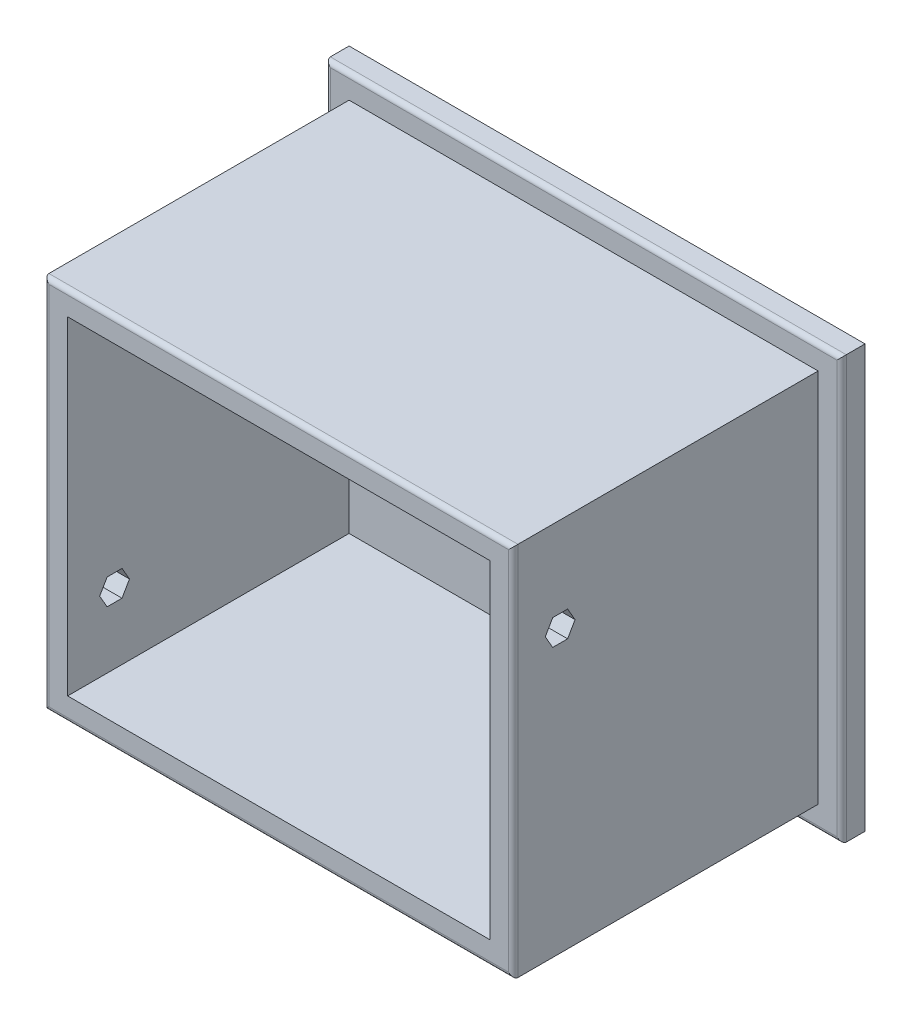
ISO-10303-21;
HEADER;
FILE_DESCRIPTION(('STEP AP214'),'2;1');
FILE_NAME('part.step','',(''),(''),'','','');
FILE_SCHEMA(('AUTOMOTIVE_DESIGN { 1 0 10303 214 1 1 1 1 }'));
ENDSEC;
DATA;
#1=APPLICATION_CONTEXT('core data for automotive mechanical design processes');
#2=APPLICATION_PROTOCOL_DEFINITION('international standard','automotive_design',2000,#1);
#3=PRODUCT_CONTEXT('',#1,'mechanical');
#4=PRODUCT('Part','Part','',(#3));
#5=PRODUCT_RELATED_PRODUCT_CATEGORY('part','',(#4));
#6=PRODUCT_DEFINITION_FORMATION('','',#4);
#7=PRODUCT_DEFINITION_CONTEXT('part definition',#1,'design');
#8=PRODUCT_DEFINITION('design','',#6,#7);
#9=PRODUCT_DEFINITION_SHAPE('','',#8);
#10=(LENGTH_UNIT() NAMED_UNIT(*) SI_UNIT(.MILLI.,.METRE.));
#11=(NAMED_UNIT(*) PLANE_ANGLE_UNIT() SI_UNIT($,.RADIAN.));
#12=(NAMED_UNIT(*) SI_UNIT($,.STERADIAN.) SOLID_ANGLE_UNIT());
#13=UNCERTAINTY_MEASURE_WITH_UNIT(LENGTH_MEASURE(1.E-05),#10,'distance_accuracy_value','');
#14=(GEOMETRIC_REPRESENTATION_CONTEXT(3) GLOBAL_UNCERTAINTY_ASSIGNED_CONTEXT((#13)) GLOBAL_UNIT_ASSIGNED_CONTEXT((#10,
#11,#12)) REPRESENTATION_CONTEXT('',''));
#15=CARTESIAN_POINT('',(0.,0.,0.));
#16=DIRECTION('',(0.,0.,1.));
#17=DIRECTION('',(1.,0.,0.));
#18=AXIS2_PLACEMENT_3D('',#15,#16,#17);
#19=CARTESIAN_POINT('',(0.,-72.1550184722737,5.));
#20=DIRECTION('',(0.,1.,0.));
#21=DIRECTION('',(-1.,0.,0.));
#22=AXIS2_PLACEMENT_3D('',#19,#20,#21);
#23=PLANE('',#22);
#24=DIRECTION('',(0.,0.,-1.));
#25=VECTOR('',#24,1.);
#26=CARTESIAN_POINT('',(1.62296722866587,-72.1550184722737,5.));
#27=LINE('',#26,#25);
#28=CARTESIAN_POINT('',(1.62296722866587,-72.1550184722737,4.));
#29=VERTEX_POINT('',#28);
#30=CARTESIAN_POINT('',(1.62296722866587,-72.1550184722737,0.));
#31=VERTEX_POINT('',#30);
#32=EDGE_CURVE('E384',#29,#31,#27,.T.);
#33=ORIENTED_EDGE('',*,*,#32,.F.);
#34=DIRECTION('',(1.,0.,0.));
#35=VECTOR('',#34,1.);
#36=CARTESIAN_POINT('',(-108.377032771334,-72.1550184722737,4.));
#37=LINE('',#36,#35);
#38=CARTESIAN_POINT('',(-108.377032771334,-72.1550184722737,4.));
#39=VERTEX_POINT('',#38);
#40=EDGE_CURVE('E11',#29,#39,#37,.F.);
#41=ORIENTED_EDGE('',*,*,#40,.T.);
#42=DIRECTION('',(0.,0.,-1.));
#43=VECTOR('',#42,1.);
#44=CARTESIAN_POINT('',(-108.377032771334,-72.1550184722737,5.));
#45=LINE('',#44,#43);
#46=CARTESIAN_POINT('',(-108.377032771334,-72.1550184722737,0.));
#47=VERTEX_POINT('',#46);
#48=EDGE_CURVE('E368',#39,#47,#45,.T.);
#49=ORIENTED_EDGE('',*,*,#48,.T.);
#50=DIRECTION('',(1.,0.,0.));
#51=VECTOR('',#50,1.);
#52=CARTESIAN_POINT('',(0.,-72.1550184722737,0.));
#53=LINE('',#52,#51);
#54=EDGE_CURVE('E348',#47,#31,#53,.T.);
#55=ORIENTED_EDGE('',*,*,#54,.T.);
#56=EDGE_LOOP('',(#33,#41,#49,#55));
#57=FACE_BOUND('',#56,.T.);
#58=ADVANCED_FACE('F35',(#57),#23,.F.);
#59=CARTESIAN_POINT('',(1.62296722866584,0.,5.));
#60=DIRECTION('',(-1.,0.,0.));
#61=DIRECTION('',(0.,-1.,0.));
#62=AXIS2_PLACEMENT_3D('',#59,#60,#61);
#63=PLANE('',#62);
#64=DIRECTION('',(0.,0.,-1.));
#65=VECTOR('',#64,1.);
#66=CARTESIAN_POINT('',(1.62296722866584,17.8449815277263,5.));
#67=LINE('',#66,#65);
#68=CARTESIAN_POINT('',(1.62296722866584,17.8449815277263,4.));
#69=VERTEX_POINT('',#68);
#70=CARTESIAN_POINT('',(1.62296722866584,17.8449815277263,0.));
#71=VERTEX_POINT('',#70);
#72=EDGE_CURVE('E382',#69,#71,#67,.T.);
#73=ORIENTED_EDGE('',*,*,#72,.F.);
#74=DIRECTION('',(0.,1.,0.));
#75=VECTOR('',#74,1.);
#76=CARTESIAN_POINT('',(1.62296722866587,-72.1550184722737,4.));
#77=LINE('',#76,#75);
#78=EDGE_CURVE('E434',#69,#29,#77,.F.);
#79=ORIENTED_EDGE('',*,*,#78,.T.);
#80=ORIENTED_EDGE('',*,*,#32,.T.);
#81=DIRECTION('',(0.,1.,0.));
#82=VECTOR('',#81,1.);
#83=CARTESIAN_POINT('',(1.62296722866584,0.,0.));
#84=LINE('',#83,#82);
#85=EDGE_CURVE('E371',#31,#71,#84,.T.);
#86=ORIENTED_EDGE('',*,*,#85,.T.);
#87=EDGE_LOOP('',(#73,#79,#80,#86));
#88=FACE_BOUND('',#87,.T.);
#89=ADVANCED_FACE('F465',(#88),#63,.F.);
#90=CARTESIAN_POINT('',(0.,17.8449815277263,5.));
#91=DIRECTION('',(0.,1.,0.));
#92=DIRECTION('',(-1.,0.,0.));
#93=AXIS2_PLACEMENT_3D('',#90,#91,#92);
#94=PLANE('',#93);
#95=DIRECTION('',(0.,0.,-1.));
#96=VECTOR('',#95,1.);
#97=CARTESIAN_POINT('',(-108.377032771334,17.8449815277263,5.));
#98=LINE('',#97,#96);
#99=CARTESIAN_POINT('',(-108.377032771334,17.8449815277263,4.));
#100=VERTEX_POINT('',#99);
#101=CARTESIAN_POINT('',(-108.377032771334,17.8449815277263,0.));
#102=VERTEX_POINT('',#101);
#103=EDGE_CURVE('E380',#100,#102,#98,.T.);
#104=ORIENTED_EDGE('',*,*,#103,.F.);
#105=DIRECTION('',(1.,0.,0.));
#106=VECTOR('',#105,1.);
#107=CARTESIAN_POINT('',(0.,17.8449815277263,4.));
#108=LINE('',#107,#106);
#109=EDGE_CURVE('E437',#100,#69,#108,.T.);
#110=ORIENTED_EDGE('',*,*,#109,.T.);
#111=ORIENTED_EDGE('',*,*,#72,.T.);
#112=DIRECTION('',(1.,0.,0.));
#113=VECTOR('',#112,1.);
#114=CARTESIAN_POINT('',(0.,17.8449815277263,0.));
#115=LINE('',#114,#113);
#116=EDGE_CURVE('E374',#102,#71,#115,.T.);
#117=ORIENTED_EDGE('',*,*,#116,.F.);
#118=EDGE_LOOP('',(#104,#110,#111,#117));
#119=FACE_BOUND('',#118,.T.);
#120=ADVANCED_FACE('F461',(#119),#94,.T.);
#121=CARTESIAN_POINT('',(-108.377032771334,0.,5.));
#122=DIRECTION('',(-1.,0.,0.));
#123=DIRECTION('',(0.,0.,1.));
#124=AXIS2_PLACEMENT_3D('',#121,#122,#123);
#125=PLANE('',#124);
#126=ORIENTED_EDGE('',*,*,#48,.F.);
#127=DIRECTION('',(0.,1.,0.));
#128=VECTOR('',#127,1.);
#129=CARTESIAN_POINT('',(-108.377032771334,0.,4.));
#130=LINE('',#129,#128);
#131=EDGE_CURVE('E44',#39,#100,#130,.T.);
#132=ORIENTED_EDGE('',*,*,#131,.T.);
#133=ORIENTED_EDGE('',*,*,#103,.T.);
#134=DIRECTION('',(0.,1.,0.));
#135=VECTOR('',#134,1.);
#136=CARTESIAN_POINT('',(-108.377032771334,0.,0.));
#137=LINE('',#136,#135);
#138=EDGE_CURVE('E359',#47,#102,#137,.T.);
#139=ORIENTED_EDGE('',*,*,#138,.F.);
#140=EDGE_LOOP('',(#126,#132,#133,#139));
#141=FACE_BOUND('',#140,.T.);
#142=ADVANCED_FACE('F475',(#141),#125,.T.);
#143=CARTESIAN_POINT('',(0.,0.,5.));
#144=DIRECTION('',(0.,0.,1.));
#145=DIRECTION('',(1.,0.,0.));
#146=AXIS2_PLACEMENT_3D('',#143,#144,#145);
#147=PLANE('',#146);
#148=DIRECTION('',(1.,0.,0.));
#149=VECTOR('',#148,1.);
#150=CARTESIAN_POINT('',(1.62296722866587,-71.1550184722737,5.));
#151=LINE('',#150,#149);
#152=CARTESIAN_POINT('',(-107.377032771334,-71.1550184722737,5.));
#153=VERTEX_POINT('',#152);
#154=CARTESIAN_POINT('',(0.622967228665867,-71.1550184722737,5.));
#155=VERTEX_POINT('',#154);
#156=EDGE_CURVE('E415',#153,#155,#151,.T.);
#157=ORIENTED_EDGE('',*,*,#156,.T.);
#158=DIRECTION('',(0.,1.,0.));
#159=VECTOR('',#158,1.);
#160=CARTESIAN_POINT('',(0.622967228665839,17.8449815277263,5.));
#161=LINE('',#160,#159);
#162=CARTESIAN_POINT('',(0.622967228665839,16.8449815277263,5.));
#163=VERTEX_POINT('',#162);
#164=EDGE_CURVE('E431',#155,#163,#161,.T.);
#165=ORIENTED_EDGE('',*,*,#164,.T.);
#166=DIRECTION('',(1.,0.,0.));
#167=VECTOR('',#166,1.);
#168=CARTESIAN_POINT('',(0.,16.8449815277263,5.));
#169=LINE('',#168,#167);
#170=CARTESIAN_POINT('',(-107.377032771334,16.8449815277263,5.));
#171=VERTEX_POINT('',#170);
#172=EDGE_CURVE('E429',#163,#171,#169,.F.);
#173=ORIENTED_EDGE('',*,*,#172,.T.);
#174=DIRECTION('',(0.,1.,0.));
#175=VECTOR('',#174,1.);
#176=CARTESIAN_POINT('',(-107.377032771334,0.,5.));
#177=LINE('',#176,#175);
#178=EDGE_CURVE('E427',#171,#153,#177,.F.);
#179=ORIENTED_EDGE('',*,*,#178,.T.);
#180=EDGE_LOOP('',(#157,#165,#173,#179));
#181=FACE_BOUND('',#180,.T.);
#182=DIRECTION('',(0.,1.,0.));
#183=VECTOR('',#182,1.);
#184=CARTESIAN_POINT('',(-3.37703277133414,0.,5.));
#185=LINE('',#184,#183);
#186=CARTESIAN_POINT('',(-3.37703277133414,-67.1550184722737,5.));
#187=VERTEX_POINT('',#186);
#188=CARTESIAN_POINT('',(-3.37703277133414,12.8449815277263,5.));
#189=VERTEX_POINT('',#188);
#190=EDGE_CURVE('E355',#187,#189,#185,.T.);
#191=ORIENTED_EDGE('',*,*,#190,.F.);
#192=DIRECTION('',(1.,0.,0.));
#193=VECTOR('',#192,1.);
#194=CARTESIAN_POINT('',(0.,-67.1550184722737,5.));
#195=LINE('',#194,#193);
#196=CARTESIAN_POINT('',(-103.377032771334,-67.1550184722737,5.));
#197=VERTEX_POINT('',#196);
#198=EDGE_CURVE('E358',#197,#187,#195,.T.);
#199=ORIENTED_EDGE('',*,*,#198,.F.);
#200=DIRECTION('',(0.,1.,0.));
#201=VECTOR('',#200,1.);
#202=CARTESIAN_POINT('',(-103.377032771334,0.,5.));
#203=LINE('',#202,#201);
#204=CARTESIAN_POINT('',(-103.377032771334,12.8449815277263,5.));
#205=VERTEX_POINT('',#204);
#206=EDGE_CURVE('E362',#197,#205,#203,.T.);
#207=ORIENTED_EDGE('',*,*,#206,.T.);
#208=DIRECTION('',(1.,0.,0.));
#209=VECTOR('',#208,1.);
#210=CARTESIAN_POINT('',(0.,12.8449815277263,5.));
#211=LINE('',#210,#209);
#212=EDGE_CURVE('E365',#205,#189,#211,.T.);
#213=ORIENTED_EDGE('',*,*,#212,.T.);
#214=EDGE_LOOP('',(#191,#199,#207,#213));
#215=FACE_BOUND('',#214,.T.);
#216=ADVANCED_FACE('F471',(#181,#215),#147,.T.);
#217=CARTESIAN_POINT('',(0.,0.,0.));
#218=DIRECTION('',(0.,0.,1.));
#219=DIRECTION('',(1.,0.,0.));
#220=AXIS2_PLACEMENT_3D('',#217,#218,#219);
#221=PLANE('',#220);
#222=ORIENTED_EDGE('',*,*,#54,.F.);
#223=ORIENTED_EDGE('',*,*,#138,.T.);
#224=ORIENTED_EDGE('',*,*,#116,.T.);
#225=ORIENTED_EDGE('',*,*,#85,.F.);
#226=EDGE_LOOP('',(#222,#223,#224,#225));
#227=FACE_BOUND('',#226,.T.);
#228=ADVANCED_FACE('F474',(#227),#221,.F.);
#229=CARTESIAN_POINT('',(0.,7.84498152772627,70.));
#230=DIRECTION('',(0.,1.,0.));
#231=DIRECTION('',(0.,0.,1.));
#232=AXIS2_PLACEMENT_3D('',#229,#230,#231);
#233=PLANE('',#232);
#234=DIRECTION('',(0.,0.,-1.));
#235=VECTOR('',#234,1.);
#236=CARTESIAN_POINT('',(-98.3770327713341,7.84498152772627,70.));
#237=LINE('',#236,#235);
#238=CARTESIAN_POINT('',(-98.3770327713341,7.84498152772627,70.));
#239=VERTEX_POINT('',#238);
#240=CARTESIAN_POINT('',(-98.3770327713341,7.84498152772627,10.));
#241=VERTEX_POINT('',#240);
#242=EDGE_CURVE('E336',#239,#241,#237,.T.);
#243=ORIENTED_EDGE('',*,*,#242,.T.);
#244=DIRECTION('',(1.,0.,0.));
#245=VECTOR('',#244,1.);
#246=CARTESIAN_POINT('',(0.,7.84498152772627,10.));
#247=LINE('',#246,#245);
#248=CARTESIAN_POINT('',(-8.37703277133414,7.84498152772627,10.));
#249=VERTEX_POINT('',#248);
#250=EDGE_CURVE('E316',#241,#249,#247,.T.);
#251=ORIENTED_EDGE('',*,*,#250,.T.);
#252=DIRECTION('',(0.,0.,-1.));
#253=VECTOR('',#252,1.);
#254=CARTESIAN_POINT('',(-8.37703277133414,7.84498152772627,70.));
#255=LINE('',#254,#253);
#256=CARTESIAN_POINT('',(-8.37703277133414,7.84498152772627,70.));
#257=VERTEX_POINT('',#256);
#258=EDGE_CURVE('E345',#257,#249,#255,.T.);
#259=ORIENTED_EDGE('',*,*,#258,.F.);
#260=DIRECTION('',(1.,0.,0.));
#261=VECTOR('',#260,1.);
#262=CARTESIAN_POINT('',(0.,7.84498152772627,70.));
#263=LINE('',#262,#261);
#264=EDGE_CURVE('E324',#239,#257,#263,.T.);
#265=ORIENTED_EDGE('',*,*,#264,.F.);
#266=EDGE_LOOP('',(#243,#251,#259,#265));
#267=FACE_BOUND('',#266,.T.);
#268=ADVANCED_FACE('F533',(#267),#233,.F.);
#269=CARTESIAN_POINT('',(-8.37703277133414,0.,70.));
#270=DIRECTION('',(1.,0.,0.));
#271=DIRECTION('',(0.,1.,0.));
#272=AXIS2_PLACEMENT_3D('',#269,#270,#271);
#273=PLANE('',#272);
#274=DIRECTION('',(0.,0.,-1.));
#275=VECTOR('',#274,1.);
#276=CARTESIAN_POINT('',(-8.37703277133414,-9.90501847227374,70.));
#277=LINE('',#276,#275);
#278=CARTESIAN_POINT('',(-8.37703277133414,-9.90501847227374,61.5877132402715));
#279=VERTEX_POINT('',#278);
#280=CARTESIAN_POINT('',(-8.37703277133414,-9.90501847227374,58.4122867597285));
#281=VERTEX_POINT('',#280);
#282=EDGE_CURVE('E308',#279,#281,#277,.T.);
#283=ORIENTED_EDGE('',*,*,#282,.T.);
#284=DIRECTION('',(0.,0.866025403784439,-0.5));
#285=VECTOR('',#284,1.);
#286=CARTESIAN_POINT('',(-8.37703277133414,-7.49388163699063,57.0202162588248));
#287=LINE('',#286,#285);
#288=CARTESIAN_POINT('',(-8.37703277133414,-7.15501847227373,56.8245735194571));
#289=VERTEX_POINT('',#288);
#290=EDGE_CURVE('E311',#281,#289,#287,.T.);
#291=ORIENTED_EDGE('',*,*,#290,.T.);
#292=DIRECTION('',(0.,0.866025403784438,0.500000000000001));
#293=VECTOR('',#292,1.);
#294=CARTESIAN_POINT('',(-8.37703277133414,3.91637240085376,63.2166440203608));
#295=LINE('',#294,#293);
#296=CARTESIAN_POINT('',(-8.37703277133414,-4.40501847227374,58.4122867597285));
#297=VERTEX_POINT('',#296);
#298=EDGE_CURVE('E286',#289,#297,#295,.T.);
#299=ORIENTED_EDGE('',*,*,#298,.T.);
#300=DIRECTION('',(0.,0.,1.));
#301=VECTOR('',#300,1.);
#302=CARTESIAN_POINT('',(-8.37703277133414,-4.40501847227374,70.));
#303=LINE('',#302,#301);
#304=CARTESIAN_POINT('',(-8.37703277133414,-4.40501847227374,61.5877132402715));
#305=VERTEX_POINT('',#304);
#306=EDGE_CURVE('E299',#297,#305,#303,.T.);
#307=ORIENTED_EDGE('',*,*,#306,.T.);
#308=DIRECTION('',(0.,-0.866025403784439,0.5));
#309=VECTOR('',#308,1.);
#310=CARTESIAN_POINT('',(-8.37703277133414,-4.74388163699063,61.7833559796392));
#311=LINE('',#310,#309);
#312=CARTESIAN_POINT('',(-8.37703277133414,-7.15501847227374,63.1754264805429));
#313=VERTEX_POINT('',#312);
#314=EDGE_CURVE('E302',#305,#313,#311,.T.);
#315=ORIENTED_EDGE('',*,*,#314,.T.);
#316=DIRECTION('',(0.,-0.866025403784438,-0.500000000000001));
#317=VECTOR('',#316,1.);
#318=CARTESIAN_POINT('',(-8.37703277133414,1.16637240085375,67.9797837411752));
#319=LINE('',#318,#317);
#320=EDGE_CURVE('E305',#313,#279,#319,.T.);
#321=ORIENTED_EDGE('',*,*,#320,.T.);
#322=EDGE_LOOP('',(#283,#291,#299,#307,#315,#321));
#323=FACE_BOUND('',#322,.T.);
#324=ORIENTED_EDGE('',*,*,#258,.T.);
#325=DIRECTION('',(0.,-1.,0.));
#326=VECTOR('',#325,1.);
#327=CARTESIAN_POINT('',(-8.37703277133414,0.,10.));
#328=LINE('',#327,#326);
#329=CARTESIAN_POINT('',(-8.37703277133413,-62.1550184722737,10.));
#330=VERTEX_POINT('',#329);
#331=EDGE_CURVE('E314',#249,#330,#328,.T.);
#332=ORIENTED_EDGE('',*,*,#331,.T.);
#333=DIRECTION('',(0.,0.,-1.));
#334=VECTOR('',#333,1.);
#335=CARTESIAN_POINT('',(-8.37703277133413,-62.1550184722737,70.));
#336=LINE('',#335,#334);
#337=CARTESIAN_POINT('',(-8.37703277133413,-62.1550184722737,70.));
#338=VERTEX_POINT('',#337);
#339=EDGE_CURVE('E342',#338,#330,#336,.T.);
#340=ORIENTED_EDGE('',*,*,#339,.F.);
#341=DIRECTION('',(0.,-1.,0.));
#342=VECTOR('',#341,1.);
#343=CARTESIAN_POINT('',(-8.37703277133414,0.,70.));
#344=LINE('',#343,#342);
#345=EDGE_CURVE('E327',#257,#338,#344,.T.);
#346=ORIENTED_EDGE('',*,*,#345,.F.);
#347=EDGE_LOOP('',(#324,#332,#340,#346));
#348=FACE_BOUND('',#347,.T.);
#349=ADVANCED_FACE('F549',(#323,#348),#273,.F.);
#350=CARTESIAN_POINT('',(0.,-62.1550184722737,70.));
#351=DIRECTION('',(0.,1.,0.));
#352=DIRECTION('',(0.,0.,1.));
#353=AXIS2_PLACEMENT_3D('',#350,#351,#352);
#354=PLANE('',#353);
#355=DIRECTION('',(1.,0.,0.));
#356=VECTOR('',#355,1.);
#357=CARTESIAN_POINT('',(0.,-62.1550184722737,10.));
#358=LINE('',#357,#356);
#359=CARTESIAN_POINT('',(-98.3770327713341,-62.1550184722737,10.));
#360=VERTEX_POINT('',#359);
#361=EDGE_CURVE('E321',#360,#330,#358,.T.);
#362=ORIENTED_EDGE('',*,*,#361,.F.);
#363=DIRECTION('',(0.,0.,-1.));
#364=VECTOR('',#363,1.);
#365=CARTESIAN_POINT('',(-98.3770327713341,-62.1550184722737,70.));
#366=LINE('',#365,#364);
#367=CARTESIAN_POINT('',(-98.3770327713341,-62.1550184722737,70.));
#368=VERTEX_POINT('',#367);
#369=EDGE_CURVE('E339',#368,#360,#366,.T.);
#370=ORIENTED_EDGE('',*,*,#369,.F.);
#371=DIRECTION('',(1.,0.,0.));
#372=VECTOR('',#371,1.);
#373=CARTESIAN_POINT('',(0.,-62.1550184722737,70.));
#374=LINE('',#373,#372);
#375=EDGE_CURVE('E329',#368,#338,#374,.T.);
#376=ORIENTED_EDGE('',*,*,#375,.T.);
#377=ORIENTED_EDGE('',*,*,#339,.T.);
#378=EDGE_LOOP('',(#362,#370,#376,#377));
#379=FACE_BOUND('',#378,.T.);
#380=ADVANCED_FACE('F538',(#379),#354,.T.);
#381=CARTESIAN_POINT('',(0.,-67.1550184722737,70.));
#382=DIRECTION('',(0.,1.,0.));
#383=DIRECTION('',(0.,0.,1.));
#384=AXIS2_PLACEMENT_3D('',#381,#382,#383);
#385=PLANE('',#384);
#386=DIRECTION('',(0.,0.,-1.));
#387=VECTOR('',#386,1.);
#388=CARTESIAN_POINT('',(-3.37703277133414,-67.1550184722737,70.));
#389=LINE('',#388,#387);
#390=CARTESIAN_POINT('',(-3.37703277133414,-67.1550184722737,69.));
#391=VERTEX_POINT('',#390);
#392=EDGE_CURVE('E340',#391,#187,#389,.T.);
#393=ORIENTED_EDGE('',*,*,#392,.F.);
#394=DIRECTION('',(1.,0.,0.));
#395=VECTOR('',#394,1.);
#396=CARTESIAN_POINT('',(-103.377032771334,-67.1550184722737,69.));
#397=LINE('',#396,#395);
#398=CARTESIAN_POINT('',(-103.377032771334,-67.1550184722737,69.));
#399=VERTEX_POINT('',#398);
#400=EDGE_CURVE('E406',#391,#399,#397,.F.);
#401=ORIENTED_EDGE('',*,*,#400,.T.);
#402=DIRECTION('',(0.,0.,-1.));
#403=VECTOR('',#402,1.);
#404=CARTESIAN_POINT('',(-103.377032771334,-67.1550184722737,70.));
#405=LINE('',#404,#403);
#406=EDGE_CURVE('E335',#399,#197,#405,.T.);
#407=ORIENTED_EDGE('',*,*,#406,.T.);
#408=ORIENTED_EDGE('',*,*,#198,.T.);
#409=EDGE_LOOP('',(#393,#401,#407,#408));
#410=FACE_BOUND('',#409,.T.);
#411=ADVANCED_FACE('F488',(#410),#385,.F.);
#412=CARTESIAN_POINT('',(-3.37703277133414,0.,70.));
#413=DIRECTION('',(-1.,0.,0.));
#414=DIRECTION('',(0.,0.,1.));
#415=AXIS2_PLACEMENT_3D('',#412,#413,#414);
#416=PLANE('',#415);
#417=DIRECTION('',(0.,0.866025403784438,0.500000000000001));
#418=VECTOR('',#417,1.);
#419=CARTESIAN_POINT('',(-3.37703277133414,-7.15501847227373,56.8245735194571));
#420=LINE('',#419,#418);
#421=CARTESIAN_POINT('',(-3.37703277133414,-7.15501847227373,56.8245735194571));
#422=VERTEX_POINT('',#421);
#423=CARTESIAN_POINT('',(-3.37703277133414,-4.40501847227374,58.4122867597285));
#424=VERTEX_POINT('',#423);
#425=EDGE_CURVE('E268',#422,#424,#420,.T.);
#426=ORIENTED_EDGE('',*,*,#425,.F.);
#427=DIRECTION('',(0.,0.866025403784439,-0.5));
#428=VECTOR('',#427,1.);
#429=CARTESIAN_POINT('',(-3.37703277133414,-9.90501847227374,58.4122867597285));
#430=LINE('',#429,#428);
#431=CARTESIAN_POINT('',(-3.37703277133414,-9.90501847227374,58.4122867597285));
#432=VERTEX_POINT('',#431);
#433=EDGE_CURVE('E260',#432,#422,#430,.T.);
#434=ORIENTED_EDGE('',*,*,#433,.F.);
#435=DIRECTION('',(0.,0.,-1.));
#436=VECTOR('',#435,1.);
#437=CARTESIAN_POINT('',(-3.37703277133414,-9.90501847227374,61.5877132402715));
#438=LINE('',#437,#436);
#439=CARTESIAN_POINT('',(-3.37703277133414,-9.90501847227374,61.5877132402715));
#440=VERTEX_POINT('',#439);
#441=EDGE_CURVE('E280',#440,#432,#438,.T.);
#442=ORIENTED_EDGE('',*,*,#441,.F.);
#443=DIRECTION('',(0.,-0.866025403784438,-0.500000000000001));
#444=VECTOR('',#443,1.);
#445=CARTESIAN_POINT('',(-3.37703277133414,-7.15501847227374,63.1754264805429));
#446=LINE('',#445,#444);
#447=CARTESIAN_POINT('',(-3.37703277133414,-7.15501847227374,63.1754264805429));
#448=VERTEX_POINT('',#447);
#449=EDGE_CURVE('E277',#448,#440,#446,.T.);
#450=ORIENTED_EDGE('',*,*,#449,.F.);
#451=DIRECTION('',(0.,-0.866025403784438,0.5));
#452=VECTOR('',#451,1.);
#453=CARTESIAN_POINT('',(-3.37703277133414,-4.40501847227374,61.5877132402715));
#454=LINE('',#453,#452);
#455=CARTESIAN_POINT('',(-3.37703277133414,-4.40501847227374,61.5877132402715));
#456=VERTEX_POINT('',#455);
#457=EDGE_CURVE('E274',#456,#448,#454,.T.);
#458=ORIENTED_EDGE('',*,*,#457,.F.);
#459=DIRECTION('',(0.,0.,1.));
#460=VECTOR('',#459,1.);
#461=CARTESIAN_POINT('',(-3.37703277133414,-4.40501847227374,58.4122867597285));
#462=LINE('',#461,#460);
#463=EDGE_CURVE('E271',#424,#456,#462,.T.);
#464=ORIENTED_EDGE('',*,*,#463,.F.);
#465=EDGE_LOOP('',(#426,#434,#442,#450,#458,#464));
#466=FACE_BOUND('',#465,.T.);
#467=DIRECTION('',(0.,0.,-1.));
#468=VECTOR('',#467,1.);
#469=CARTESIAN_POINT('',(-3.37703277133414,12.8449815277263,70.));
#470=LINE('',#469,#468);
#471=CARTESIAN_POINT('',(-3.37703277133414,12.8449815277263,69.));
#472=VERTEX_POINT('',#471);
#473=EDGE_CURVE('E352',#472,#189,#470,.T.);
#474=ORIENTED_EDGE('',*,*,#473,.F.);
#475=DIRECTION('',(0.,1.,0.));
#476=VECTOR('',#475,1.);
#477=CARTESIAN_POINT('',(-3.37703277133414,-67.1550184722737,69.));
#478=LINE('',#477,#476);
#479=EDGE_CURVE('E409',#472,#391,#478,.F.);
#480=ORIENTED_EDGE('',*,*,#479,.T.);
#481=ORIENTED_EDGE('',*,*,#392,.T.);
#482=ORIENTED_EDGE('',*,*,#190,.T.);
#483=EDGE_LOOP('',(#474,#480,#481,#482));
#484=FACE_BOUND('',#483,.T.);
#485=ADVANCED_FACE('F482',(#466,#484),#416,.F.);
#486=CARTESIAN_POINT('',(0.,12.8449815277263,70.));
#487=DIRECTION('',(0.,1.,0.));
#488=DIRECTION('',(0.,0.,1.));
#489=AXIS2_PLACEMENT_3D('',#486,#487,#488);
#490=PLANE('',#489);
#491=DIRECTION('',(0.,0.,-1.));
#492=VECTOR('',#491,1.);
#493=CARTESIAN_POINT('',(-103.377032771334,12.8449815277263,70.));
#494=LINE('',#493,#492);
#495=CARTESIAN_POINT('',(-103.377032771334,12.8449815277263,69.));
#496=VERTEX_POINT('',#495);
#497=EDGE_CURVE('E350',#496,#205,#494,.T.);
#498=ORIENTED_EDGE('',*,*,#497,.F.);
#499=DIRECTION('',(1.,0.,0.));
#500=VECTOR('',#499,1.);
#501=CARTESIAN_POINT('',(0.,12.8449815277263,69.));
#502=LINE('',#501,#500);
#503=EDGE_CURVE('E411',#496,#472,#502,.T.);
#504=ORIENTED_EDGE('',*,*,#503,.T.);
#505=ORIENTED_EDGE('',*,*,#473,.T.);
#506=ORIENTED_EDGE('',*,*,#212,.F.);
#507=EDGE_LOOP('',(#498,#504,#505,#506));
#508=FACE_BOUND('',#507,.T.);
#509=ADVANCED_FACE('F495',(#508),#490,.T.);
#510=CARTESIAN_POINT('',(-103.377032771334,0.,70.));
#511=DIRECTION('',(-1.,0.,0.));
#512=DIRECTION('',(0.,0.,1.));
#513=AXIS2_PLACEMENT_3D('',#510,#511,#512);
#514=PLANE('',#513);
#515=DIRECTION('',(0.,0.866025403784439,0.499999999999999));
#516=VECTOR('',#515,1.);
#517=CARTESIAN_POINT('',(-103.377032771334,-49.9050184722737,61.5877132402715));
#518=LINE('',#517,#516);
#519=CARTESIAN_POINT('',(-103.377032771334,-49.9050184722737,61.5877132402715));
#520=VERTEX_POINT('',#519);
#521=CARTESIAN_POINT('',(-103.377032771334,-47.1550184722737,63.175426480543));
#522=VERTEX_POINT('',#521);
#523=EDGE_CURVE('E241',#520,#522,#518,.T.);
#524=ORIENTED_EDGE('',*,*,#523,.F.);
#525=DIRECTION('',(0.,0.,1.));
#526=VECTOR('',#525,1.);
#527=CARTESIAN_POINT('',(-103.377032771334,-49.9050184722737,58.4122867597285));
#528=LINE('',#527,#526);
#529=CARTESIAN_POINT('',(-103.377032771334,-49.9050184722737,58.4122867597285));
#530=VERTEX_POINT('',#529);
#531=EDGE_CURVE('E255',#530,#520,#528,.T.);
#532=ORIENTED_EDGE('',*,*,#531,.F.);
#533=DIRECTION('',(0.,-0.866025403784438,0.5));
#534=VECTOR('',#533,1.);
#535=CARTESIAN_POINT('',(-103.377032771334,-47.1550184722737,56.8245735194571));
#536=LINE('',#535,#534);
#537=CARTESIAN_POINT('',(-103.377032771334,-47.1550184722737,56.8245735194571));
#538=VERTEX_POINT('',#537);
#539=EDGE_CURVE('E249',#538,#530,#536,.T.);
#540=ORIENTED_EDGE('',*,*,#539,.F.);
#541=DIRECTION('',(0.,-0.866025403784439,-0.499999999999999));
#542=VECTOR('',#541,1.);
#543=CARTESIAN_POINT('',(-103.377032771334,-44.4050184722737,58.4122867597285));
#544=LINE('',#543,#542);
#545=CARTESIAN_POINT('',(-103.377032771334,-44.4050184722737,58.4122867597285));
#546=VERTEX_POINT('',#545);
#547=EDGE_CURVE('E247',#546,#538,#544,.T.);
#548=ORIENTED_EDGE('',*,*,#547,.F.);
#549=DIRECTION('',(0.,0.,-1.));
#550=VECTOR('',#549,1.);
#551=CARTESIAN_POINT('',(-103.377032771334,-44.4050184722737,61.5877132402715));
#552=LINE('',#551,#550);
#553=CARTESIAN_POINT('',(-103.377032771334,-44.4050184722737,61.5877132402715));
#554=VERTEX_POINT('',#553);
#555=EDGE_CURVE('E225',#554,#546,#552,.T.);
#556=ORIENTED_EDGE('',*,*,#555,.F.);
#557=DIRECTION('',(0.,0.866025403784438,-0.5));
#558=VECTOR('',#557,1.);
#559=CARTESIAN_POINT('',(-103.377032771334,-47.1550184722737,63.175426480543));
#560=LINE('',#559,#558);
#561=EDGE_CURVE('E236',#522,#554,#560,.T.);
#562=ORIENTED_EDGE('',*,*,#561,.F.);
#563=EDGE_LOOP('',(#524,#532,#540,#548,#556,#562));
#564=FACE_BOUND('',#563,.T.);
#565=ORIENTED_EDGE('',*,*,#406,.F.);
#566=DIRECTION('',(0.,1.,0.));
#567=VECTOR('',#566,1.);
#568=CARTESIAN_POINT('',(-103.377032771334,0.,69.));
#569=LINE('',#568,#567);
#570=EDGE_CURVE('E413',#399,#496,#569,.T.);
#571=ORIENTED_EDGE('',*,*,#570,.T.);
#572=ORIENTED_EDGE('',*,*,#497,.T.);
#573=ORIENTED_EDGE('',*,*,#206,.F.);
#574=EDGE_LOOP('',(#565,#571,#572,#573));
#575=FACE_BOUND('',#574,.T.);
#576=ADVANCED_FACE('F243',(#564,#575),#514,.T.);
#577=CARTESIAN_POINT('',(-98.3770327713341,0.,70.));
#578=DIRECTION('',(1.,0.,0.));
#579=DIRECTION('',(0.,1.,0.));
#580=AXIS2_PLACEMENT_3D('',#577,#578,#579);
#581=PLANE('',#580);
#582=DIRECTION('',(0.,-0.866025403784439,-0.499999999999999));
#583=VECTOR('',#582,1.);
#584=CARTESIAN_POINT('',(-98.3770327713341,-8.83362759914622,85.3002918168639));
#585=LINE('',#584,#583);
#586=CARTESIAN_POINT('',(-98.3770327713341,-47.1550184722737,63.175426480543));
#587=VERTEX_POINT('',#586);
#588=CARTESIAN_POINT('',(-98.3770327713341,-49.9050184722737,61.5877132402715));
#589=VERTEX_POINT('',#588);
#590=EDGE_CURVE('E395',#587,#589,#585,.T.);
#591=ORIENTED_EDGE('',*,*,#590,.F.);
#592=DIRECTION('',(0.,-0.866025403784438,0.5));
#593=VECTOR('',#592,1.);
#594=CARTESIAN_POINT('',(-98.3770327713341,-14.7438816369906,44.4628479039505));
#595=LINE('',#594,#593);
#596=CARTESIAN_POINT('',(-98.3770327713341,-44.4050184722737,61.5877132402715));
#597=VERTEX_POINT('',#596);
#598=EDGE_CURVE('E386',#597,#587,#595,.T.);
#599=ORIENTED_EDGE('',*,*,#598,.F.);
#600=DIRECTION('',(0.,0.,1.));
#601=VECTOR('',#600,1.);
#602=CARTESIAN_POINT('',(-98.3770327713341,-44.4050184722737,70.));
#603=LINE('',#602,#601);
#604=CARTESIAN_POINT('',(-98.3770327713341,-44.4050184722737,58.4122867597285));
#605=VERTEX_POINT('',#604);
#606=EDGE_CURVE('E228',#605,#597,#603,.T.);
#607=ORIENTED_EDGE('',*,*,#606,.F.);
#608=DIRECTION('',(0.,0.866025403784439,0.499999999999999));
#609=VECTOR('',#608,1.);
#610=CARTESIAN_POINT('',(-98.3770327713341,-6.08362759914621,80.5371520960495));
#611=LINE('',#610,#609);
#612=CARTESIAN_POINT('',(-98.3770327713341,-47.1550184722737,56.8245735194571));
#613=VERTEX_POINT('',#612);
#614=EDGE_CURVE('E389',#613,#605,#611,.T.);
#615=ORIENTED_EDGE('',*,*,#614,.F.);
#616=DIRECTION('',(0.,0.866025403784438,-0.5));
#617=VECTOR('',#616,1.);
#618=CARTESIAN_POINT('',(-98.3770327713341,-17.4938816369907,39.699708183136));
#619=LINE('',#618,#617);
#620=CARTESIAN_POINT('',(-98.3770327713341,-49.9050184722737,58.4122867597285));
#621=VERTEX_POINT('',#620);
#622=EDGE_CURVE('E391',#621,#613,#619,.T.);
#623=ORIENTED_EDGE('',*,*,#622,.F.);
#624=DIRECTION('',(0.,0.,-1.));
#625=VECTOR('',#624,1.);
#626=CARTESIAN_POINT('',(-98.3770327713341,-49.9050184722737,70.));
#627=LINE('',#626,#625);
#628=EDGE_CURVE('E393',#589,#621,#627,.T.);
#629=ORIENTED_EDGE('',*,*,#628,.F.);
#630=EDGE_LOOP('',(#591,#599,#607,#615,#623,#629));
#631=FACE_BOUND('',#630,.T.);
#632=DIRECTION('',(0.,-1.,0.));
#633=VECTOR('',#632,1.);
#634=CARTESIAN_POINT('',(-98.3770327713341,0.,10.));
#635=LINE('',#634,#633);
#636=EDGE_CURVE('E318',#241,#360,#635,.T.);
#637=ORIENTED_EDGE('',*,*,#636,.F.);
#638=ORIENTED_EDGE('',*,*,#242,.F.);
#639=DIRECTION('',(0.,-1.,0.));
#640=VECTOR('',#639,1.);
#641=CARTESIAN_POINT('',(-98.3770327713341,0.,70.));
#642=LINE('',#641,#640);
#643=EDGE_CURVE('E332',#239,#368,#642,.T.);
#644=ORIENTED_EDGE('',*,*,#643,.T.);
#645=ORIENTED_EDGE('',*,*,#369,.T.);
#646=EDGE_LOOP('',(#637,#638,#644,#645));
#647=FACE_BOUND('',#646,.T.);
#648=ADVANCED_FACE('F546',(#631,#647),#581,.T.);
#649=CARTESIAN_POINT('',(0.,0.,70.));
#650=DIRECTION('',(0.,0.,1.));
#651=DIRECTION('',(1.,0.,0.));
#652=AXIS2_PLACEMENT_3D('',#649,#650,#651);
#653=PLANE('',#652);
#654=DIRECTION('',(0.,1.,0.));
#655=VECTOR('',#654,1.);
#656=CARTESIAN_POINT('',(-102.377032771334,0.,70.));
#657=LINE('',#656,#655);
#658=CARTESIAN_POINT('',(-102.377032771334,11.8449815277263,70.));
#659=VERTEX_POINT('',#658);
#660=CARTESIAN_POINT('',(-102.377032771334,-66.1550184722737,70.));
#661=VERTEX_POINT('',#660);
#662=EDGE_CURVE('E397',#659,#661,#657,.F.);
#663=ORIENTED_EDGE('',*,*,#662,.T.);
#664=DIRECTION('',(1.,0.,0.));
#665=VECTOR('',#664,1.);
#666=CARTESIAN_POINT('',(-3.37703277133414,-66.1550184722737,70.));
#667=LINE('',#666,#665);
#668=CARTESIAN_POINT('',(-4.37703277133414,-66.1550184722737,70.));
#669=VERTEX_POINT('',#668);
#670=EDGE_CURVE('E403',#661,#669,#667,.T.);
#671=ORIENTED_EDGE('',*,*,#670,.T.);
#672=DIRECTION('',(0.,1.,0.));
#673=VECTOR('',#672,1.);
#674=CARTESIAN_POINT('',(-4.37703277133414,12.8449815277263,70.));
#675=LINE('',#674,#673);
#676=CARTESIAN_POINT('',(-4.37703277133414,11.8449815277263,70.));
#677=VERTEX_POINT('',#676);
#678=EDGE_CURVE('E401',#669,#677,#675,.T.);
#679=ORIENTED_EDGE('',*,*,#678,.T.);
#680=DIRECTION('',(1.,0.,0.));
#681=VECTOR('',#680,1.);
#682=CARTESIAN_POINT('',(0.,11.8449815277263,70.));
#683=LINE('',#682,#681);
#684=EDGE_CURVE('E399',#677,#659,#683,.F.);
#685=ORIENTED_EDGE('',*,*,#684,.T.);
#686=EDGE_LOOP('',(#663,#671,#679,#685));
#687=FACE_BOUND('',#686,.T.);
#688=ORIENTED_EDGE('',*,*,#264,.T.);
#689=ORIENTED_EDGE('',*,*,#345,.T.);
#690=ORIENTED_EDGE('',*,*,#375,.F.);
#691=ORIENTED_EDGE('',*,*,#643,.F.);
#692=EDGE_LOOP('',(#688,#689,#690,#691));
#693=FACE_BOUND('',#692,.T.);
#694=ADVANCED_FACE('F506',(#687,#693),#653,.T.);
#695=CARTESIAN_POINT('',(0.,0.,10.));
#696=DIRECTION('',(0.,0.,1.));
#697=DIRECTION('',(1.,0.,0.));
#698=AXIS2_PLACEMENT_3D('',#695,#696,#697);
#699=PLANE('',#698);
#700=ORIENTED_EDGE('',*,*,#331,.F.);
#701=ORIENTED_EDGE('',*,*,#250,.F.);
#702=ORIENTED_EDGE('',*,*,#636,.T.);
#703=ORIENTED_EDGE('',*,*,#361,.T.);
#704=EDGE_LOOP('',(#700,#701,#702,#703));
#705=FACE_BOUND('',#704,.T.);
#706=ADVANCED_FACE('F562',(#705),#699,.T.);
#707=CARTESIAN_POINT('',(-13.3770327713341,-9.90501847227374,58.4122867597285));
#708=DIRECTION('',(0.,-0.5,-0.866025403784439));
#709=DIRECTION('',(0.,0.866025403784439,-0.5));
#710=AXIS2_PLACEMENT_3D('',#707,#708,#709);
#711=PLANE('',#710);
#712=DIRECTION('',(1.,0.,0.));
#713=VECTOR('',#712,1.);
#714=CARTESIAN_POINT('',(-13.3770327713341,-9.90501847227374,58.4122867597285));
#715=LINE('',#714,#713);
#716=EDGE_CURVE('E284',#281,#432,#715,.T.);
#717=ORIENTED_EDGE('',*,*,#716,.T.);
#718=ORIENTED_EDGE('',*,*,#433,.T.);
#719=DIRECTION('',(1.,0.,0.));
#720=VECTOR('',#719,1.);
#721=CARTESIAN_POINT('',(-13.3770327713341,-7.15501847227373,56.8245735194571));
#722=LINE('',#721,#720);
#723=EDGE_CURVE('E283',#289,#422,#722,.T.);
#724=ORIENTED_EDGE('',*,*,#723,.F.);
#725=ORIENTED_EDGE('',*,*,#290,.F.);
#726=EDGE_LOOP('',(#717,#718,#724,#725));
#727=FACE_BOUND('',#726,.T.);
#728=ADVANCED_FACE('F565',(#727),#711,.F.);
#729=CARTESIAN_POINT('',(-13.3770327713341,-9.90501847227374,61.5877132402715));
#730=DIRECTION('',(0.,-1.,0.));
#731=DIRECTION('',(0.,0.,-1.));
#732=AXIS2_PLACEMENT_3D('',#729,#730,#731);
#733=PLANE('',#732);
#734=DIRECTION('',(1.,0.,0.));
#735=VECTOR('',#734,1.);
#736=CARTESIAN_POINT('',(-13.3770327713341,-9.90501847227374,61.5877132402715));
#737=LINE('',#736,#735);
#738=EDGE_CURVE('E287',#279,#440,#737,.T.);
#739=ORIENTED_EDGE('',*,*,#738,.T.);
#740=ORIENTED_EDGE('',*,*,#441,.T.);
#741=ORIENTED_EDGE('',*,*,#716,.F.);
#742=ORIENTED_EDGE('',*,*,#282,.F.);
#743=EDGE_LOOP('',(#739,#740,#741,#742));
#744=FACE_BOUND('',#743,.T.);
#745=ADVANCED_FACE('F569',(#744),#733,.F.);
#746=CARTESIAN_POINT('',(-13.3770327713341,-7.15501847227374,63.1754264805429));
#747=DIRECTION('',(0.,-0.500000000000001,0.866025403784438));
#748=DIRECTION('',(0.,-0.866025403784438,-0.500000000000001));
#749=AXIS2_PLACEMENT_3D('',#746,#747,#748);
#750=PLANE('',#749);
#751=DIRECTION('',(1.,0.,0.));
#752=VECTOR('',#751,1.);
#753=CARTESIAN_POINT('',(-13.3770327713341,-7.15501847227374,63.1754264805429));
#754=LINE('',#753,#752);
#755=EDGE_CURVE('E289',#313,#448,#754,.T.);
#756=ORIENTED_EDGE('',*,*,#755,.T.);
#757=ORIENTED_EDGE('',*,*,#449,.T.);
#758=ORIENTED_EDGE('',*,*,#738,.F.);
#759=ORIENTED_EDGE('',*,*,#320,.F.);
#760=EDGE_LOOP('',(#756,#757,#758,#759));
#761=FACE_BOUND('',#760,.T.);
#762=ADVANCED_FACE('F583',(#761),#750,.F.);
#763=CARTESIAN_POINT('',(-13.3770327713341,-4.40501847227374,61.5877132402715));
#764=DIRECTION('',(0.,0.5,0.866025403784439));
#765=DIRECTION('',(0.,-0.866025403784439,0.5));
#766=AXIS2_PLACEMENT_3D('',#763,#764,#765);
#767=PLANE('',#766);
#768=DIRECTION('',(1.,0.,0.));
#769=VECTOR('',#768,1.);
#770=CARTESIAN_POINT('',(-13.3770327713341,-4.40501847227374,61.5877132402715));
#771=LINE('',#770,#769);
#772=EDGE_CURVE('E291',#305,#456,#771,.T.);
#773=ORIENTED_EDGE('',*,*,#772,.T.);
#774=ORIENTED_EDGE('',*,*,#457,.T.);
#775=ORIENTED_EDGE('',*,*,#755,.F.);
#776=ORIENTED_EDGE('',*,*,#314,.F.);
#777=EDGE_LOOP('',(#773,#774,#775,#776));
#778=FACE_BOUND('',#777,.T.);
#779=ADVANCED_FACE('F579',(#778),#767,.F.);
#780=CARTESIAN_POINT('',(-13.3770327713341,-4.40501847227374,58.4122867597285));
#781=DIRECTION('',(0.,1.,0.));
#782=DIRECTION('',(0.,0.,1.));
#783=AXIS2_PLACEMENT_3D('',#780,#781,#782);
#784=PLANE('',#783);
#785=DIRECTION('',(1.,0.,0.));
#786=VECTOR('',#785,1.);
#787=CARTESIAN_POINT('',(-13.3770327713341,-4.40501847227374,58.4122867597285));
#788=LINE('',#787,#786);
#789=EDGE_CURVE('E293',#297,#424,#788,.T.);
#790=ORIENTED_EDGE('',*,*,#789,.T.);
#791=ORIENTED_EDGE('',*,*,#463,.T.);
#792=ORIENTED_EDGE('',*,*,#772,.F.);
#793=ORIENTED_EDGE('',*,*,#306,.F.);
#794=EDGE_LOOP('',(#790,#791,#792,#793));
#795=FACE_BOUND('',#794,.T.);
#796=ADVANCED_FACE('F575',(#795),#784,.F.);
#797=CARTESIAN_POINT('',(-13.3770327713341,-7.15501847227373,56.8245735194571));
#798=DIRECTION('',(0.,0.500000000000001,-0.866025403784438));
#799=DIRECTION('',(0.,0.866025403784438,0.500000000000001));
#800=AXIS2_PLACEMENT_3D('',#797,#798,#799);
#801=PLANE('',#800);
#802=ORIENTED_EDGE('',*,*,#723,.T.);
#803=ORIENTED_EDGE('',*,*,#425,.T.);
#804=ORIENTED_EDGE('',*,*,#789,.F.);
#805=ORIENTED_EDGE('',*,*,#298,.F.);
#806=EDGE_LOOP('',(#802,#803,#804,#805));
#807=FACE_BOUND('',#806,.T.);
#808=ADVANCED_FACE('F571',(#807),#801,.F.);
#809=CARTESIAN_POINT('',(-93.3770327713341,-49.9050184722737,61.5877132402715));
#810=DIRECTION('',(0.,-0.499999999999999,0.866025403784439));
#811=DIRECTION('',(0.,-0.866025403784439,-0.499999999999999));
#812=AXIS2_PLACEMENT_3D('',#809,#810,#811);
#813=PLANE('',#812);
#814=ORIENTED_EDGE('',*,*,#590,.T.);
#815=DIRECTION('',(-1.,0.,0.));
#816=VECTOR('',#815,1.);
#817=CARTESIAN_POINT('',(-93.3770327713341,-49.9050184722737,61.5877132402715));
#818=LINE('',#817,#816);
#819=EDGE_CURVE('E258',#589,#520,#818,.T.);
#820=ORIENTED_EDGE('',*,*,#819,.T.);
#821=ORIENTED_EDGE('',*,*,#523,.T.);
#822=DIRECTION('',(-1.,0.,0.));
#823=VECTOR('',#822,1.);
#824=CARTESIAN_POINT('',(-93.3770327713341,-47.1550184722737,63.175426480543));
#825=LINE('',#824,#823);
#826=EDGE_CURVE('E232',#587,#522,#825,.T.);
#827=ORIENTED_EDGE('',*,*,#826,.F.);
#828=EDGE_LOOP('',(#814,#820,#821,#827));
#829=FACE_BOUND('',#828,.T.);
#830=ADVANCED_FACE('F574',(#829),#813,.F.);
#831=CARTESIAN_POINT('',(-93.3770327713341,-49.9050184722737,58.4122867597285));
#832=DIRECTION('',(0.,-1.,0.));
#833=DIRECTION('',(0.,0.,-1.));
#834=AXIS2_PLACEMENT_3D('',#831,#832,#833);
#835=PLANE('',#834);
#836=ORIENTED_EDGE('',*,*,#628,.T.);
#837=DIRECTION('',(-1.,0.,0.));
#838=VECTOR('',#837,1.);
#839=CARTESIAN_POINT('',(-93.3770327713341,-49.9050184722737,58.4122867597285));
#840=LINE('',#839,#838);
#841=EDGE_CURVE('E261',#621,#530,#840,.T.);
#842=ORIENTED_EDGE('',*,*,#841,.T.);
#843=ORIENTED_EDGE('',*,*,#531,.T.);
#844=ORIENTED_EDGE('',*,*,#819,.F.);
#845=EDGE_LOOP('',(#836,#842,#843,#844));
#846=FACE_BOUND('',#845,.T.);
#847=ADVANCED_FACE('F593',(#846),#835,.F.);
#848=CARTESIAN_POINT('',(-93.3770327713341,-47.1550184722737,56.8245735194571));
#849=DIRECTION('',(0.,-0.5,-0.866025403784438));
#850=DIRECTION('',(0.,0.866025403784438,-0.5));
#851=AXIS2_PLACEMENT_3D('',#848,#849,#850);
#852=PLANE('',#851);
#853=ORIENTED_EDGE('',*,*,#622,.T.);
#854=DIRECTION('',(-1.,0.,0.));
#855=VECTOR('',#854,1.);
#856=CARTESIAN_POINT('',(-93.3770327713341,-47.1550184722737,56.8245735194571));
#857=LINE('',#856,#855);
#858=EDGE_CURVE('E263',#613,#538,#857,.T.);
#859=ORIENTED_EDGE('',*,*,#858,.T.);
#860=ORIENTED_EDGE('',*,*,#539,.T.);
#861=ORIENTED_EDGE('',*,*,#841,.F.);
#862=EDGE_LOOP('',(#853,#859,#860,#861));
#863=FACE_BOUND('',#862,.T.);
#864=ADVANCED_FACE('F602',(#863),#852,.F.);
#865=CARTESIAN_POINT('',(-93.3770327713341,-44.4050184722737,58.4122867597285));
#866=DIRECTION('',(0.,0.499999999999999,-0.866025403784439));
#867=DIRECTION('',(0.,0.866025403784439,0.499999999999999));
#868=AXIS2_PLACEMENT_3D('',#865,#866,#867);
#869=PLANE('',#868);
#870=ORIENTED_EDGE('',*,*,#614,.T.);
#871=DIRECTION('',(-1.,0.,0.));
#872=VECTOR('',#871,1.);
#873=CARTESIAN_POINT('',(-93.3770327713341,-44.4050184722737,58.4122867597285));
#874=LINE('',#873,#872);
#875=EDGE_CURVE('E231',#605,#546,#874,.T.);
#876=ORIENTED_EDGE('',*,*,#875,.T.);
#877=ORIENTED_EDGE('',*,*,#547,.T.);
#878=ORIENTED_EDGE('',*,*,#858,.F.);
#879=EDGE_LOOP('',(#870,#876,#877,#878));
#880=FACE_BOUND('',#879,.T.);
#881=ADVANCED_FACE('F599',(#880),#869,.F.);
#882=CARTESIAN_POINT('',(-93.3770327713341,-44.4050184722737,61.5877132402715));
#883=DIRECTION('',(0.,1.,0.));
#884=DIRECTION('',(0.,0.,1.));
#885=AXIS2_PLACEMENT_3D('',#882,#883,#884);
#886=PLANE('',#885);
#887=ORIENTED_EDGE('',*,*,#606,.T.);
#888=DIRECTION('',(-1.,0.,0.));
#889=VECTOR('',#888,1.);
#890=CARTESIAN_POINT('',(-93.3770327713341,-44.4050184722737,61.5877132402715));
#891=LINE('',#890,#889);
#892=EDGE_CURVE('E220',#597,#554,#891,.T.);
#893=ORIENTED_EDGE('',*,*,#892,.T.);
#894=ORIENTED_EDGE('',*,*,#555,.T.);
#895=ORIENTED_EDGE('',*,*,#875,.F.);
#896=EDGE_LOOP('',(#887,#893,#894,#895));
#897=FACE_BOUND('',#896,.T.);
#898=ADVANCED_FACE('F222',(#897),#886,.F.);
#899=CARTESIAN_POINT('',(-93.3770327713341,-47.1550184722737,63.175426480543));
#900=DIRECTION('',(0.,0.5,0.866025403784438));
#901=DIRECTION('',(0.,-0.866025403784438,0.5));
#902=AXIS2_PLACEMENT_3D('',#899,#900,#901);
#903=PLANE('',#902);
#904=ORIENTED_EDGE('',*,*,#598,.T.);
#905=ORIENTED_EDGE('',*,*,#826,.T.);
#906=ORIENTED_EDGE('',*,*,#561,.T.);
#907=ORIENTED_EDGE('',*,*,#892,.F.);
#908=EDGE_LOOP('',(#904,#905,#906,#907));
#909=FACE_BOUND('',#908,.T.);
#910=ADVANCED_FACE('F237',(#909),#903,.F.);
#911=CARTESIAN_POINT('',(0.,11.8449815277263,69.));
#912=DIRECTION('',(1.,0.,0.));
#913=DIRECTION('',(0.,0.,-1.));
#914=AXIS2_PLACEMENT_3D('',#911,#912,#913);
#915=CYLINDRICAL_SURFACE('',#914,1.);
#916=CARTESIAN_POINT('',(-4.37703277133414,11.8449815277263,69.));
#917=DIRECTION('',(0.707106781186547,-0.707106781186547,0.));
#918=DIRECTION('',(0.707106781186547,0.707106781186547,0.));
#919=AXIS2_PLACEMENT_3D('',#916,#917,#918);
#920=ELLIPSE('',#919,1.41421356237309,1.);
#921=EDGE_CURVE('E420',#472,#677,#920,.T.);
#922=ORIENTED_EDGE('',*,*,#921,.F.);
#923=ORIENTED_EDGE('',*,*,#503,.F.);
#924=CARTESIAN_POINT('',(-102.377032771334,11.8449815277263,69.));
#925=DIRECTION('',(0.707106781186547,0.707106781186547,0.));
#926=DIRECTION('',(-0.707106781186547,0.707106781186547,0.));
#927=AXIS2_PLACEMENT_3D('',#924,#925,#926);
#928=ELLIPSE('',#927,1.41421356237309,1.);
#929=EDGE_CURVE('E423',#659,#496,#928,.F.);
#930=ORIENTED_EDGE('',*,*,#929,.F.);
#931=ORIENTED_EDGE('',*,*,#684,.F.);
#932=EDGE_LOOP('',(#922,#923,#930,#931));
#933=FACE_BOUND('',#932,.T.);
#934=ADVANCED_FACE('F498',(#933),#915,.T.);
#935=CARTESIAN_POINT('',(-102.377032771334,0.,69.));
#936=DIRECTION('',(0.,1.,0.));
#937=DIRECTION('',(0.,0.,1.));
#938=AXIS2_PLACEMENT_3D('',#935,#936,#937);
#939=CYLINDRICAL_SURFACE('',#938,1.);
#940=ORIENTED_EDGE('',*,*,#929,.T.);
#941=ORIENTED_EDGE('',*,*,#570,.F.);
#942=CARTESIAN_POINT('',(-102.377032771334,-66.1550184722737,69.));
#943=DIRECTION('',(-0.707106781186547,0.707106781186547,0.));
#944=DIRECTION('',(0.707106781186547,0.707106781186547,0.));
#945=AXIS2_PLACEMENT_3D('',#942,#943,#944);
#946=ELLIPSE('',#945,1.41421356237309,1.);
#947=EDGE_CURVE('E418',#661,#399,#946,.F.);
#948=ORIENTED_EDGE('',*,*,#947,.F.);
#949=ORIENTED_EDGE('',*,*,#662,.F.);
#950=EDGE_LOOP('',(#940,#941,#948,#949));
#951=FACE_BOUND('',#950,.T.);
#952=ADVANCED_FACE('F502',(#951),#939,.T.);
#953=CARTESIAN_POINT('',(-4.37703277133414,0.,69.));
#954=DIRECTION('',(0.,-1.,0.));
#955=DIRECTION('',(0.,0.,-1.));
#956=AXIS2_PLACEMENT_3D('',#953,#954,#955);
#957=CYLINDRICAL_SURFACE('',#956,1.);
#958=ORIENTED_EDGE('',*,*,#921,.T.);
#959=ORIENTED_EDGE('',*,*,#678,.F.);
#960=CARTESIAN_POINT('',(-4.37703277133414,-66.1550184722737,69.));
#961=DIRECTION('',(-0.707106781186547,-0.707106781186547,0.));
#962=DIRECTION('',(0.707106781186547,-0.707106781186547,0.));
#963=AXIS2_PLACEMENT_3D('',#960,#961,#962);
#964=ELLIPSE('',#963,1.41421356237309,1.);
#965=EDGE_CURVE('E416',#391,#669,#964,.T.);
#966=ORIENTED_EDGE('',*,*,#965,.F.);
#967=ORIENTED_EDGE('',*,*,#479,.F.);
#968=EDGE_LOOP('',(#958,#959,#966,#967));
#969=FACE_BOUND('',#968,.T.);
#970=ADVANCED_FACE('F510',(#969),#957,.T.);
#971=CARTESIAN_POINT('',(0.,-66.1550184722737,69.));
#972=DIRECTION('',(-1.,0.,0.));
#973=DIRECTION('',(0.,0.,1.));
#974=AXIS2_PLACEMENT_3D('',#971,#972,#973);
#975=CYLINDRICAL_SURFACE('',#974,1.);
#976=ORIENTED_EDGE('',*,*,#947,.T.);
#977=ORIENTED_EDGE('',*,*,#400,.F.);
#978=ORIENTED_EDGE('',*,*,#965,.T.);
#979=ORIENTED_EDGE('',*,*,#670,.F.);
#980=EDGE_LOOP('',(#976,#977,#978,#979));
#981=FACE_BOUND('',#980,.T.);
#982=ADVANCED_FACE('F513',(#981),#975,.T.);
#983=CARTESIAN_POINT('',(-107.377032771334,0.,4.));
#984=DIRECTION('',(0.,1.,0.));
#985=DIRECTION('',(0.,0.,1.));
#986=AXIS2_PLACEMENT_3D('',#983,#984,#985);
#987=CYLINDRICAL_SURFACE('',#986,1.);
#988=CARTESIAN_POINT('',(-107.377032771334,16.8449815277263,4.));
#989=DIRECTION('',(0.707106781186547,0.707106781186548,0.));
#990=DIRECTION('',(-0.707106781186548,0.707106781186547,0.));
#991=AXIS2_PLACEMENT_3D('',#988,#989,#990);
#992=ELLIPSE('',#991,1.41421356237309,1.);
#993=EDGE_CURVE('E443',#100,#171,#992,.T.);
#994=ORIENTED_EDGE('',*,*,#993,.F.);
#995=ORIENTED_EDGE('',*,*,#131,.F.);
#996=CARTESIAN_POINT('',(-107.377032771334,-71.1550184722737,4.));
#997=DIRECTION('',(-0.707106781186548,0.707106781186547,0.));
#998=DIRECTION('',(-0.707106781186547,-0.707106781186548,0.));
#999=AXIS2_PLACEMENT_3D('',#996,#997,#998);
#1000=ELLIPSE('',#999,1.4142135623731,1.);
#1001=EDGE_CURVE('E39',#153,#39,#1000,.F.);
#1002=ORIENTED_EDGE('',*,*,#1001,.F.);
#1003=ORIENTED_EDGE('',*,*,#178,.F.);
#1004=EDGE_LOOP('',(#994,#995,#1002,#1003));
#1005=FACE_BOUND('',#1004,.T.);
#1006=ADVANCED_FACE('F37',(#1005),#987,.T.);
#1007=CARTESIAN_POINT('',(0.,-71.1550184722737,4.));
#1008=DIRECTION('',(-1.,0.,0.));
#1009=DIRECTION('',(0.,-1.,0.));
#1010=AXIS2_PLACEMENT_3D('',#1007,#1008,#1009);
#1011=CYLINDRICAL_SURFACE('',#1010,1.);
#1012=ORIENTED_EDGE('',*,*,#1001,.T.);
#1013=ORIENTED_EDGE('',*,*,#40,.F.);
#1014=CARTESIAN_POINT('',(0.622967228665867,-71.1550184722737,4.));
#1015=DIRECTION('',(-0.707106781186547,-0.707106781186548,0.));
#1016=DIRECTION('',(-0.707106781186548,0.707106781186547,0.));
#1017=AXIS2_PLACEMENT_3D('',#1014,#1015,#1016);
#1018=ELLIPSE('',#1017,1.4142135623731,1.);
#1019=EDGE_CURVE('E442',#155,#29,#1018,.F.);
#1020=ORIENTED_EDGE('',*,*,#1019,.F.);
#1021=ORIENTED_EDGE('',*,*,#156,.F.);
#1022=EDGE_LOOP('',(#1012,#1013,#1020,#1021));
#1023=FACE_BOUND('',#1022,.T.);
#1024=ADVANCED_FACE('F453',(#1023),#1011,.T.);
#1025=CARTESIAN_POINT('',(0.,16.8449815277263,4.));
#1026=DIRECTION('',(1.,0.,0.));
#1027=DIRECTION('',(0.,1.,0.));
#1028=AXIS2_PLACEMENT_3D('',#1025,#1026,#1027);
#1029=CYLINDRICAL_SURFACE('',#1028,1.);
#1030=ORIENTED_EDGE('',*,*,#993,.T.);
#1031=ORIENTED_EDGE('',*,*,#172,.F.);
#1032=CARTESIAN_POINT('',(0.622967228665839,16.8449815277263,4.));
#1033=DIRECTION('',(0.707106781186548,-0.707106781186547,0.));
#1034=DIRECTION('',(0.707106781186547,0.707106781186548,0.));
#1035=AXIS2_PLACEMENT_3D('',#1032,#1033,#1034);
#1036=ELLIPSE('',#1035,1.41421356237309,1.);
#1037=EDGE_CURVE('E440',#69,#163,#1036,.T.);
#1038=ORIENTED_EDGE('',*,*,#1037,.F.);
#1039=ORIENTED_EDGE('',*,*,#109,.F.);
#1040=EDGE_LOOP('',(#1030,#1031,#1038,#1039));
#1041=FACE_BOUND('',#1040,.T.);
#1042=ADVANCED_FACE('F458',(#1041),#1029,.T.);
#1043=CARTESIAN_POINT('',(0.622967228665845,0.,4.));
#1044=DIRECTION('',(0.,-1.,0.));
#1045=DIRECTION('',(1.,0.,0.));
#1046=AXIS2_PLACEMENT_3D('',#1043,#1044,#1045);
#1047=CYLINDRICAL_SURFACE('',#1046,1.);
#1048=ORIENTED_EDGE('',*,*,#1019,.T.);
#1049=ORIENTED_EDGE('',*,*,#78,.F.);
#1050=ORIENTED_EDGE('',*,*,#1037,.T.);
#1051=ORIENTED_EDGE('',*,*,#164,.F.);
#1052=EDGE_LOOP('',(#1048,#1049,#1050,#1051));
#1053=FACE_BOUND('',#1052,.T.);
#1054=ADVANCED_FACE('F468',(#1053),#1047,.T.);
#1055=CLOSED_SHELL('',(#58,#89,#120,#142,#216,#228,#268,#349,#380,#411,#485,#509,#576,#648,#694,
#706,#728,#745,#762,#779,#796,#808,#830,#847,#864,#881,#898,#910,#934,#952,#970,#982,#1006,
#1024,#1042,#1054));
#1056=MANIFOLD_SOLID_BREP('B2',#1055);
#1057=ADVANCED_BREP_SHAPE_REPRESENTATION('',(#18,#1056),#14);
#1058=SHAPE_DEFINITION_REPRESENTATION(#9,#1057);
ENDSEC;
END-ISO-10303-21;
